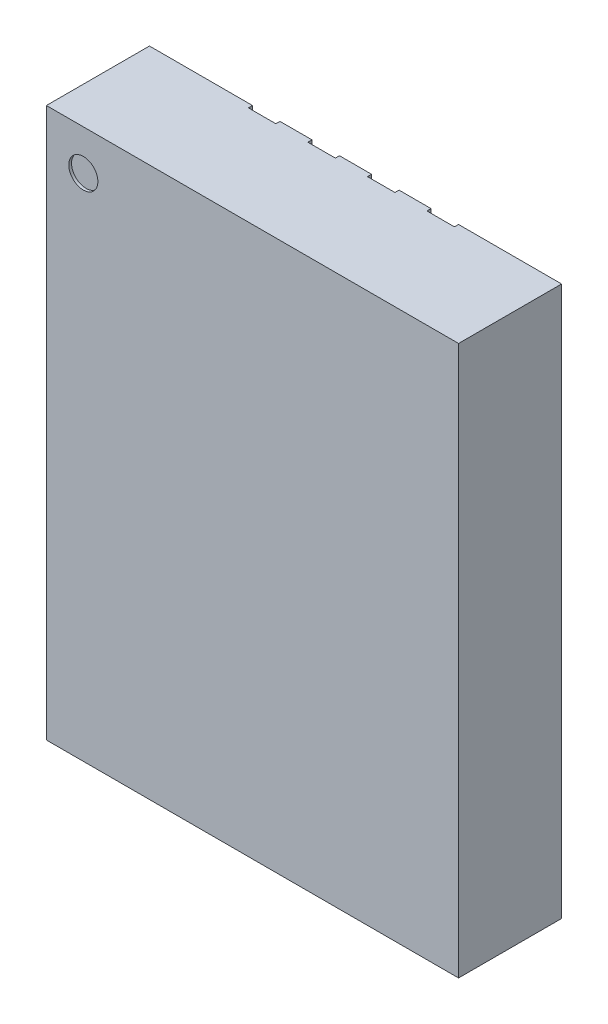
ISO-10303-21;
HEADER;
FILE_DESCRIPTION(('STEP AP214'),'2;1');
FILE_NAME('part.step','',(''),(''),'','','');
FILE_SCHEMA(('AUTOMOTIVE_DESIGN { 1 0 10303 214 1 1 1 1 }'));
ENDSEC;
DATA;
#1=APPLICATION_CONTEXT('core data for automotive mechanical design processes');
#2=APPLICATION_PROTOCOL_DEFINITION('international standard','automotive_design',2000,#1);
#3=PRODUCT_CONTEXT('',#1,'mechanical');
#4=PRODUCT('Part','Part','',(#3));
#5=PRODUCT_RELATED_PRODUCT_CATEGORY('part','',(#4));
#6=PRODUCT_DEFINITION_FORMATION('','',#4);
#7=PRODUCT_DEFINITION_CONTEXT('part definition',#1,'design');
#8=PRODUCT_DEFINITION('design','',#6,#7);
#9=PRODUCT_DEFINITION_SHAPE('','',#8);
#10=(LENGTH_UNIT() NAMED_UNIT(*) SI_UNIT(.MILLI.,.METRE.));
#11=(NAMED_UNIT(*) PLANE_ANGLE_UNIT() SI_UNIT($,.RADIAN.));
#12=(NAMED_UNIT(*) SI_UNIT($,.STERADIAN.) SOLID_ANGLE_UNIT());
#13=UNCERTAINTY_MEASURE_WITH_UNIT(LENGTH_MEASURE(1.E-05),#10,'distance_accuracy_value','');
#14=(GEOMETRIC_REPRESENTATION_CONTEXT(3) GLOBAL_UNCERTAINTY_ASSIGNED_CONTEXT((#13)) GLOBAL_UNIT_ASSIGNED_CONTEXT((#10,
#11,#12)) REPRESENTATION_CONTEXT('',''));
#15=CARTESIAN_POINT('',(0.,0.,0.));
#16=DIRECTION('',(0.,0.,1.));
#17=DIRECTION('',(1.,0.,0.));
#18=AXIS2_PLACEMENT_3D('',#15,#16,#17);
#19=CARTESIAN_POINT('',(-1.231222,1.707331,0.73));
#20=DIRECTION('',(0.,0.,1.));
#21=DIRECTION('',(1.,0.,0.));
#22=AXIS2_PLACEMENT_3D('',#19,#20,#21);
#23=PLANE('',#22);
#24=CARTESIAN_POINT('',(-1.231222,1.707331,0.73));
#25=DIRECTION('',(0.,0.,1.));
#26=DIRECTION('',(1.,0.,0.));
#27=AXIS2_PLACEMENT_3D('',#24,#25,#26);
#28=CIRCLE('',#27,0.105928);
#29=CARTESIAN_POINT('',(-1.33715,1.707331,0.73));
#30=VERTEX_POINT('',#29);
#31=EDGE_CURVE('E27',#30,#30,#28,.T.);
#32=ORIENTED_EDGE('',*,*,#31,.T.);
#33=EDGE_LOOP('',(#32));
#34=FACE_BOUND('',#33,.T.);
#35=ADVANCED_FACE('F17',(#34),#23,.T.);
#36=CARTESIAN_POINT('',(0.55,-1.425,0.));
#37=DIRECTION('',(0.,-1.,0.));
#38=DIRECTION('',(0.,0.,-1.));
#39=AXIS2_PLACEMENT_3D('',#36,#37,#38);
#40=PLANE('',#39);
#41=DIRECTION('',(0.,0.,1.));
#42=VECTOR('',#41,1.);
#43=CARTESIAN_POINT('',(0.55,-1.425,0.));
#44=LINE('',#43,#42);
#45=CARTESIAN_POINT('',(0.55,-1.425,0.));
#46=VERTEX_POINT('',#45);
#47=CARTESIAN_POINT('',(0.55,-1.425,0.03));
#48=VERTEX_POINT('',#47);
#49=EDGE_CURVE('E21',#46,#48,#44,.T.);
#50=ORIENTED_EDGE('',*,*,#49,.F.);
#51=DIRECTION('',(-1.,0.,0.));
#52=VECTOR('',#51,1.);
#53=CARTESIAN_POINT('',(0.55,-1.425,0.));
#54=LINE('',#53,#52);
#55=CARTESIAN_POINT('',(0.316666666667,-1.425,0.));
#56=VERTEX_POINT('',#55);
#57=EDGE_CURVE('E660',#46,#56,#54,.T.);
#58=ORIENTED_EDGE('',*,*,#57,.T.);
#59=DIRECTION('',(0.,0.,1.));
#60=VECTOR('',#59,1.);
#61=CARTESIAN_POINT('',(0.316666666667,-1.425,0.));
#62=LINE('',#61,#60);
#63=CARTESIAN_POINT('',(0.316666666667,-1.425,0.03));
#64=VERTEX_POINT('',#63);
#65=EDGE_CURVE('E488',#56,#64,#62,.T.);
#66=ORIENTED_EDGE('',*,*,#65,.T.);
#67=DIRECTION('',(-1.,0.,0.));
#68=VECTOR('',#67,1.);
#69=CARTESIAN_POINT('',(0.55,-1.425,0.03));
#70=LINE('',#69,#68);
#71=EDGE_CURVE('E372',#48,#64,#70,.T.);
#72=ORIENTED_EDGE('',*,*,#71,.F.);
#73=EDGE_LOOP('',(#50,#58,#66,#72));
#74=FACE_BOUND('',#73,.T.);
#75=ADVANCED_FACE('F19',(#74),#40,.F.);
#76=CARTESIAN_POINT('',(0.116666666667,-1.425,0.));
#77=DIRECTION('',(0.,-1.,0.));
#78=DIRECTION('',(0.,0.,-1.));
#79=AXIS2_PLACEMENT_3D('',#76,#77,#78);
#80=PLANE('',#79);
#81=DIRECTION('',(0.,0.,1.));
#82=VECTOR('',#81,1.);
#83=CARTESIAN_POINT('',(0.116666666667,-1.425,0.));
#84=LINE('',#83,#82);
#85=CARTESIAN_POINT('',(0.116666666667,-1.425,0.));
#86=VERTEX_POINT('',#85);
#87=CARTESIAN_POINT('',(0.116666666667,-1.425,0.03));
#88=VERTEX_POINT('',#87);
#89=EDGE_CURVE('E492',#86,#88,#84,.T.);
#90=ORIENTED_EDGE('',*,*,#89,.F.);
#91=DIRECTION('',(-1.,0.,0.));
#92=VECTOR('',#91,1.);
#93=CARTESIAN_POINT('',(0.116666666667,-1.425,0.));
#94=LINE('',#93,#92);
#95=CARTESIAN_POINT('',(-0.116666666667,-1.425,0.));
#96=VERTEX_POINT('',#95);
#97=EDGE_CURVE('E399',#86,#96,#94,.T.);
#98=ORIENTED_EDGE('',*,*,#97,.T.);
#99=DIRECTION('',(0.,0.,1.));
#100=VECTOR('',#99,1.);
#101=CARTESIAN_POINT('',(-0.116666666667,-1.425,0.));
#102=LINE('',#101,#100);
#103=CARTESIAN_POINT('',(-0.116666666667,-1.425,0.03));
#104=VERTEX_POINT('',#103);
#105=EDGE_CURVE('E468',#96,#104,#102,.T.);
#106=ORIENTED_EDGE('',*,*,#105,.T.);
#107=DIRECTION('',(-1.,0.,0.));
#108=VECTOR('',#107,1.);
#109=CARTESIAN_POINT('',(0.116666666667,-1.425,0.03));
#110=LINE('',#109,#108);
#111=EDGE_CURVE('E582',#88,#104,#110,.T.);
#112=ORIENTED_EDGE('',*,*,#111,.F.);
#113=EDGE_LOOP('',(#90,#98,#106,#112));
#114=FACE_BOUND('',#113,.T.);
#115=ADVANCED_FACE('F697',(#114),#80,.F.);
#116=CARTESIAN_POINT('',(-0.316666666667,-1.425,0.));
#117=DIRECTION('',(0.,-1.,0.));
#118=DIRECTION('',(0.,0.,-1.));
#119=AXIS2_PLACEMENT_3D('',#116,#117,#118);
#120=PLANE('',#119);
#121=DIRECTION('',(0.,0.,1.));
#122=VECTOR('',#121,1.);
#123=CARTESIAN_POINT('',(-0.316666666667,-1.425,0.));
#124=LINE('',#123,#122);
#125=CARTESIAN_POINT('',(-0.316666666667,-1.425,0.));
#126=VERTEX_POINT('',#125);
#127=CARTESIAN_POINT('',(-0.316666666667,-1.425,0.03));
#128=VERTEX_POINT('',#127);
#129=EDGE_CURVE('E442',#126,#128,#124,.T.);
#130=ORIENTED_EDGE('',*,*,#129,.F.);
#131=DIRECTION('',(-1.,0.,0.));
#132=VECTOR('',#131,1.);
#133=CARTESIAN_POINT('',(-0.316666666667,-1.425,0.));
#134=LINE('',#133,#132);
#135=CARTESIAN_POINT('',(-0.55,-1.425,0.));
#136=VERTEX_POINT('',#135);
#137=EDGE_CURVE('E443',#126,#136,#134,.T.);
#138=ORIENTED_EDGE('',*,*,#137,.T.);
#139=DIRECTION('',(0.,0.,1.));
#140=VECTOR('',#139,1.);
#141=CARTESIAN_POINT('',(-0.55,-1.425,0.));
#142=LINE('',#141,#140);
#143=CARTESIAN_POINT('',(-0.55,-1.425,0.03));
#144=VERTEX_POINT('',#143);
#145=EDGE_CURVE('E641',#136,#144,#142,.T.);
#146=ORIENTED_EDGE('',*,*,#145,.T.);
#147=DIRECTION('',(-1.,0.,0.));
#148=VECTOR('',#147,1.);
#149=CARTESIAN_POINT('',(-0.316666666667,-1.425,0.03));
#150=LINE('',#149,#148);
#151=EDGE_CURVE('E479',#128,#144,#150,.T.);
#152=ORIENTED_EDGE('',*,*,#151,.F.);
#153=EDGE_LOOP('',(#130,#138,#146,#152));
#154=FACE_BOUND('',#153,.T.);
#155=ADVANCED_FACE('F714',(#154),#120,.F.);
#156=CARTESIAN_POINT('',(-0.316666666667,1.425,0.));
#157=DIRECTION('',(0.,-1.,0.));
#158=DIRECTION('',(0.,0.,-1.));
#159=AXIS2_PLACEMENT_3D('',#156,#157,#158);
#160=PLANE('',#159);
#161=DIRECTION('',(0.,0.,1.));
#162=VECTOR('',#161,1.);
#163=CARTESIAN_POINT('',(-0.316666666667,1.425,0.));
#164=LINE('',#163,#162);
#165=CARTESIAN_POINT('',(-0.316666666667,1.425,0.));
#166=VERTEX_POINT('',#165);
#167=CARTESIAN_POINT('',(-0.316666666667,1.425,0.03));
#168=VERTEX_POINT('',#167);
#169=EDGE_CURVE('E473',#166,#168,#164,.T.);
#170=ORIENTED_EDGE('',*,*,#169,.T.);
#171=DIRECTION('',(-1.,0.,0.));
#172=VECTOR('',#171,1.);
#173=CARTESIAN_POINT('',(-0.316666666667,1.425,0.03));
#174=LINE('',#173,#172);
#175=CARTESIAN_POINT('',(-0.55,1.425,0.03));
#176=VERTEX_POINT('',#175);
#177=EDGE_CURVE('E367',#168,#176,#174,.T.);
#178=ORIENTED_EDGE('',*,*,#177,.T.);
#179=DIRECTION('',(0.,0.,1.));
#180=VECTOR('',#179,1.);
#181=CARTESIAN_POINT('',(-0.55,1.425,0.));
#182=LINE('',#181,#180);
#183=CARTESIAN_POINT('',(-0.55,1.425,0.));
#184=VERTEX_POINT('',#183);
#185=EDGE_CURVE('E638',#184,#176,#182,.T.);
#186=ORIENTED_EDGE('',*,*,#185,.F.);
#187=DIRECTION('',(-1.,0.,0.));
#188=VECTOR('',#187,1.);
#189=CARTESIAN_POINT('',(-0.316666666667,1.425,0.));
#190=LINE('',#189,#188);
#191=EDGE_CURVE('E421',#166,#184,#190,.T.);
#192=ORIENTED_EDGE('',*,*,#191,.F.);
#193=EDGE_LOOP('',(#170,#178,#186,#192));
#194=FACE_BOUND('',#193,.T.);
#195=ADVANCED_FACE('F732',(#194),#160,.T.);
#196=CARTESIAN_POINT('',(0.116666666667,1.425,0.));
#197=DIRECTION('',(0.,-1.,0.));
#198=DIRECTION('',(0.,0.,-1.));
#199=AXIS2_PLACEMENT_3D('',#196,#197,#198);
#200=PLANE('',#199);
#201=DIRECTION('',(0.,0.,1.));
#202=VECTOR('',#201,1.);
#203=CARTESIAN_POINT('',(0.116666666667,1.425,0.));
#204=LINE('',#203,#202);
#205=CARTESIAN_POINT('',(0.116666666667,1.425,0.));
#206=VERTEX_POINT('',#205);
#207=CARTESIAN_POINT('',(0.116666666667,1.425,0.03));
#208=VERTEX_POINT('',#207);
#209=EDGE_CURVE('E478',#206,#208,#204,.T.);
#210=ORIENTED_EDGE('',*,*,#209,.T.);
#211=DIRECTION('',(-1.,0.,0.));
#212=VECTOR('',#211,1.);
#213=CARTESIAN_POINT('',(0.116666666667,1.425,0.03));
#214=LINE('',#213,#212);
#215=CARTESIAN_POINT('',(-0.116666666667,1.425,0.03));
#216=VERTEX_POINT('',#215);
#217=EDGE_CURVE('E611',#208,#216,#214,.T.);
#218=ORIENTED_EDGE('',*,*,#217,.T.);
#219=DIRECTION('',(0.,0.,1.));
#220=VECTOR('',#219,1.);
#221=CARTESIAN_POINT('',(-0.116666666667,1.425,0.));
#222=LINE('',#221,#220);
#223=CARTESIAN_POINT('',(-0.116666666667,1.425,0.));
#224=VERTEX_POINT('',#223);
#225=EDGE_CURVE('E471',#224,#216,#222,.T.);
#226=ORIENTED_EDGE('',*,*,#225,.F.);
#227=DIRECTION('',(-1.,0.,0.));
#228=VECTOR('',#227,1.);
#229=CARTESIAN_POINT('',(0.116666666667,1.425,0.));
#230=LINE('',#229,#228);
#231=EDGE_CURVE('E604',#206,#224,#230,.T.);
#232=ORIENTED_EDGE('',*,*,#231,.F.);
#233=EDGE_LOOP('',(#210,#218,#226,#232));
#234=FACE_BOUND('',#233,.T.);
#235=ADVANCED_FACE('F744',(#234),#200,.T.);
#236=CARTESIAN_POINT('',(0.55,1.425,0.));
#237=DIRECTION('',(0.,-1.,0.));
#238=DIRECTION('',(0.,0.,-1.));
#239=AXIS2_PLACEMENT_3D('',#236,#237,#238);
#240=PLANE('',#239);
#241=DIRECTION('',(0.,0.,1.));
#242=VECTOR('',#241,1.);
#243=CARTESIAN_POINT('',(0.55,1.425,0.));
#244=LINE('',#243,#242);
#245=CARTESIAN_POINT('',(0.55,1.425,0.));
#246=VERTEX_POINT('',#245);
#247=CARTESIAN_POINT('',(0.55,1.425,0.03));
#248=VERTEX_POINT('',#247);
#249=EDGE_CURVE('E530',#246,#248,#244,.T.);
#250=ORIENTED_EDGE('',*,*,#249,.T.);
#251=DIRECTION('',(-1.,0.,0.));
#252=VECTOR('',#251,1.);
#253=CARTESIAN_POINT('',(0.55,1.425,0.03));
#254=LINE('',#253,#252);
#255=CARTESIAN_POINT('',(0.316666666667,1.425,0.03));
#256=VERTEX_POINT('',#255);
#257=EDGE_CURVE('E342',#248,#256,#254,.T.);
#258=ORIENTED_EDGE('',*,*,#257,.T.);
#259=DIRECTION('',(0.,0.,1.));
#260=VECTOR('',#259,1.);
#261=CARTESIAN_POINT('',(0.316666666667,1.425,0.));
#262=LINE('',#261,#260);
#263=CARTESIAN_POINT('',(0.316666666667,1.425,0.));
#264=VERTEX_POINT('',#263);
#265=EDGE_CURVE('E413',#264,#256,#262,.T.);
#266=ORIENTED_EDGE('',*,*,#265,.F.);
#267=DIRECTION('',(-1.,0.,0.));
#268=VECTOR('',#267,1.);
#269=CARTESIAN_POINT('',(0.55,1.425,0.));
#270=LINE('',#269,#268);
#271=EDGE_CURVE('E414',#246,#264,#270,.T.);
#272=ORIENTED_EDGE('',*,*,#271,.F.);
#273=EDGE_LOOP('',(#250,#258,#266,#272));
#274=FACE_BOUND('',#273,.T.);
#275=ADVANCED_FACE('F760',(#274),#240,.T.);
#276=CARTESIAN_POINT('',(-1.231222,1.707331,0.75));
#277=DIRECTION('',(0.,0.,1.));
#278=DIRECTION('',(1.,0.,0.));
#279=AXIS2_PLACEMENT_3D('',#276,#277,#278);
#280=CYLINDRICAL_SURFACE('',#279,0.105928);
#281=ORIENTED_EDGE('',*,*,#31,.F.);
#282=DIRECTION('',(0.,0.,1.));
#283=VECTOR('',#282,1.);
#284=CARTESIAN_POINT('',(-1.33715,1.707331,0.75));
#285=LINE('',#284,#283);
#286=CARTESIAN_POINT('',(-1.33715,1.707331,0.75));
#287=VERTEX_POINT('',#286);
#288=EDGE_CURVE('E11',#30,#287,#285,.T.);
#289=ORIENTED_EDGE('',*,*,#288,.T.);
#290=CARTESIAN_POINT('',(-1.231222,1.707331,0.75));
#291=DIRECTION('',(0.,0.,1.));
#292=DIRECTION('',(1.,0.,0.));
#293=AXIS2_PLACEMENT_3D('',#290,#291,#292);
#294=CIRCLE('',#293,0.105928);
#295=EDGE_CURVE('E433',#287,#287,#294,.T.);
#296=ORIENTED_EDGE('',*,*,#295,.T.);
#297=ORIENTED_EDGE('',*,*,#288,.F.);
#298=EDGE_LOOP('',(#281,#289,#296,#297));
#299=FACE_BOUND('',#298,.T.);
#300=ADVANCED_FACE('F821',(#299),#280,.F.);
#301=CARTESIAN_POINT('',(0.55,-2.,0.));
#302=DIRECTION('',(-1.,0.,0.));
#303=DIRECTION('',(0.,0.,1.));
#304=AXIS2_PLACEMENT_3D('',#301,#302,#303);
#305=PLANE('',#304);
#306=DIRECTION('',(0.,0.,1.));
#307=VECTOR('',#306,1.);
#308=CARTESIAN_POINT('',(0.55,-2.,0.));
#309=LINE('',#308,#307);
#310=CARTESIAN_POINT('',(0.55,-2.,0.));
#311=VERTEX_POINT('',#310);
#312=CARTESIAN_POINT('',(0.55,-2.,0.03));
#313=VERTEX_POINT('',#312);
#314=EDGE_CURVE('E451',#311,#313,#309,.T.);
#315=ORIENTED_EDGE('',*,*,#314,.F.);
#316=DIRECTION('',(0.,1.,0.));
#317=VECTOR('',#316,1.);
#318=CARTESIAN_POINT('',(0.55,-2.,0.));
#319=LINE('',#318,#317);
#320=EDGE_CURVE('E662',#311,#46,#319,.T.);
#321=ORIENTED_EDGE('',*,*,#320,.T.);
#322=ORIENTED_EDGE('',*,*,#49,.T.);
#323=DIRECTION('',(0.,1.,0.));
#324=VECTOR('',#323,1.);
#325=CARTESIAN_POINT('',(0.55,-2.,0.03));
#326=LINE('',#325,#324);
#327=EDGE_CURVE('E368',#313,#48,#326,.T.);
#328=ORIENTED_EDGE('',*,*,#327,.F.);
#329=EDGE_LOOP('',(#315,#321,#322,#328));
#330=FACE_BOUND('',#329,.T.);
#331=ADVANCED_FACE('F671',(#330),#305,.F.);
#332=CARTESIAN_POINT('',(0.,0.,0.));
#333=DIRECTION('',(0.,0.,1.));
#334=DIRECTION('',(1.,0.,0.));
#335=AXIS2_PLACEMENT_3D('',#332,#333,#334);
#336=PLANE('',#335);
#337=DIRECTION('',(0.,-1.,0.));
#338=VECTOR('',#337,1.);
#339=CARTESIAN_POINT('',(0.316666666667,-1.425,0.));
#340=LINE('',#339,#338);
#341=CARTESIAN_POINT('',(0.316666666667,-2.,0.));
#342=VERTEX_POINT('',#341);
#343=EDGE_CURVE('E491',#56,#342,#340,.T.);
#344=ORIENTED_EDGE('',*,*,#343,.F.);
#345=ORIENTED_EDGE('',*,*,#57,.F.);
#346=ORIENTED_EDGE('',*,*,#320,.F.);
#347=DIRECTION('',(1.,0.,0.));
#348=VECTOR('',#347,1.);
#349=CARTESIAN_POINT('',(-1.5,-2.,0.));
#350=LINE('',#349,#348);
#351=EDGE_CURVE('E456',#342,#311,#350,.T.);
#352=ORIENTED_EDGE('',*,*,#351,.F.);
#353=EDGE_LOOP('',(#344,#345,#346,#352));
#354=FACE_BOUND('',#353,.T.);
#355=ADVANCED_FACE('F685',(#354),#336,.F.);
#356=CARTESIAN_POINT('',(0.316666666667,-1.425,0.));
#357=DIRECTION('',(1.,0.,0.));
#358=DIRECTION('',(0.,1.,0.));
#359=AXIS2_PLACEMENT_3D('',#356,#357,#358);
#360=PLANE('',#359);
#361=ORIENTED_EDGE('',*,*,#65,.F.);
#362=ORIENTED_EDGE('',*,*,#343,.T.);
#363=DIRECTION('',(0.,0.,1.));
#364=VECTOR('',#363,1.);
#365=CARTESIAN_POINT('',(0.316666666667,-2.,0.));
#366=LINE('',#365,#364);
#367=CARTESIAN_POINT('',(0.316666666667,-2.,0.03));
#368=VERTEX_POINT('',#367);
#369=EDGE_CURVE('E534',#342,#368,#366,.T.);
#370=ORIENTED_EDGE('',*,*,#369,.T.);
#371=DIRECTION('',(0.,-1.,0.));
#372=VECTOR('',#371,1.);
#373=CARTESIAN_POINT('',(0.316666666667,-1.425,0.03));
#374=LINE('',#373,#372);
#375=EDGE_CURVE('E572',#64,#368,#374,.T.);
#376=ORIENTED_EDGE('',*,*,#375,.F.);
#377=EDGE_LOOP('',(#361,#362,#370,#376));
#378=FACE_BOUND('',#377,.T.);
#379=ADVANCED_FACE('F687',(#378),#360,.F.);
#380=CARTESIAN_POINT('',(0.116666666667,-2.,0.));
#381=DIRECTION('',(-1.,0.,0.));
#382=DIRECTION('',(0.,0.,1.));
#383=AXIS2_PLACEMENT_3D('',#380,#381,#382);
#384=PLANE('',#383);
#385=DIRECTION('',(0.,0.,1.));
#386=VECTOR('',#385,1.);
#387=CARTESIAN_POINT('',(0.116666666667,-2.,0.));
#388=LINE('',#387,#386);
#389=CARTESIAN_POINT('',(0.116666666667,-2.,0.));
#390=VERTEX_POINT('',#389);
#391=CARTESIAN_POINT('',(0.116666666667,-2.,0.03));
#392=VERTEX_POINT('',#391);
#393=EDGE_CURVE('E503',#390,#392,#388,.T.);
#394=ORIENTED_EDGE('',*,*,#393,.F.);
#395=DIRECTION('',(0.,1.,0.));
#396=VECTOR('',#395,1.);
#397=CARTESIAN_POINT('',(0.116666666667,-2.,0.));
#398=LINE('',#397,#396);
#399=EDGE_CURVE('E402',#390,#86,#398,.T.);
#400=ORIENTED_EDGE('',*,*,#399,.T.);
#401=ORIENTED_EDGE('',*,*,#89,.T.);
#402=DIRECTION('',(0.,1.,0.));
#403=VECTOR('',#402,1.);
#404=CARTESIAN_POINT('',(0.116666666667,-2.,0.03));
#405=LINE('',#404,#403);
#406=EDGE_CURVE('E575',#392,#88,#405,.T.);
#407=ORIENTED_EDGE('',*,*,#406,.F.);
#408=EDGE_LOOP('',(#394,#400,#401,#407));
#409=FACE_BOUND('',#408,.T.);
#410=ADVANCED_FACE('F693',(#409),#384,.F.);
#411=CARTESIAN_POINT('',(0.,0.,0.));
#412=DIRECTION('',(0.,0.,1.));
#413=DIRECTION('',(1.,0.,0.));
#414=AXIS2_PLACEMENT_3D('',#411,#412,#413);
#415=PLANE('',#414);
#416=DIRECTION('',(0.,-1.,0.));
#417=VECTOR('',#416,1.);
#418=CARTESIAN_POINT('',(-0.116666666667,-1.425,0.));
#419=LINE('',#418,#417);
#420=CARTESIAN_POINT('',(-0.116666666667,-2.,0.));
#421=VERTEX_POINT('',#420);
#422=EDGE_CURVE('E403',#96,#421,#419,.T.);
#423=ORIENTED_EDGE('',*,*,#422,.F.);
#424=ORIENTED_EDGE('',*,*,#97,.F.);
#425=ORIENTED_EDGE('',*,*,#399,.F.);
#426=DIRECTION('',(1.,0.,0.));
#427=VECTOR('',#426,1.);
#428=CARTESIAN_POINT('',(-1.5,-2.,0.));
#429=LINE('',#428,#427);
#430=EDGE_CURVE('E389',#421,#390,#429,.T.);
#431=ORIENTED_EDGE('',*,*,#430,.F.);
#432=EDGE_LOOP('',(#423,#424,#425,#431));
#433=FACE_BOUND('',#432,.T.);
#434=ADVANCED_FACE('F813',(#433),#415,.F.);
#435=CARTESIAN_POINT('',(-0.116666666667,-1.425,0.));
#436=DIRECTION('',(1.,0.,0.));
#437=DIRECTION('',(0.,1.,0.));
#438=AXIS2_PLACEMENT_3D('',#435,#436,#437);
#439=PLANE('',#438);
#440=ORIENTED_EDGE('',*,*,#105,.F.);
#441=ORIENTED_EDGE('',*,*,#422,.T.);
#442=DIRECTION('',(0.,0.,1.));
#443=VECTOR('',#442,1.);
#444=CARTESIAN_POINT('',(-0.116666666667,-2.,0.));
#445=LINE('',#444,#443);
#446=CARTESIAN_POINT('',(-0.116666666667,-2.,0.03));
#447=VERTEX_POINT('',#446);
#448=EDGE_CURVE('E385',#421,#447,#445,.T.);
#449=ORIENTED_EDGE('',*,*,#448,.T.);
#450=DIRECTION('',(0.,-1.,0.));
#451=VECTOR('',#450,1.);
#452=CARTESIAN_POINT('',(-0.116666666667,-1.425,0.03));
#453=LINE('',#452,#451);
#454=EDGE_CURVE('E586',#104,#447,#453,.T.);
#455=ORIENTED_EDGE('',*,*,#454,.F.);
#456=EDGE_LOOP('',(#440,#441,#449,#455));
#457=FACE_BOUND('',#456,.T.);
#458=ADVANCED_FACE('F702',(#457),#439,.F.);
#459=CARTESIAN_POINT('',(-0.316666666667,-1.999999996663,0.));
#460=DIRECTION('',(-1.,0.,0.));
#461=DIRECTION('',(0.,0.,1.));
#462=AXIS2_PLACEMENT_3D('',#459,#460,#461);
#463=PLANE('',#462);
#464=DIRECTION('',(0.,0.,1.));
#465=VECTOR('',#464,1.);
#466=CARTESIAN_POINT('',(-0.316666666667,-1.999999996663,0.));
#467=LINE('',#466,#465);
#468=CARTESIAN_POINT('',(-0.316666666667,-1.9999999983933,0.));
#469=VERTEX_POINT('',#468);
#470=CARTESIAN_POINT('',(-0.316666666667,-1.99999999728096,0.03));
#471=VERTEX_POINT('',#470);
#472=EDGE_CURVE('E354',#469,#471,#467,.T.);
#473=ORIENTED_EDGE('',*,*,#472,.F.);
#474=DIRECTION('',(0.,1.,0.));
#475=VECTOR('',#474,1.);
#476=CARTESIAN_POINT('',(-0.316666666667,-1.999999996663,0.));
#477=LINE('',#476,#475);
#478=EDGE_CURVE('E438',#469,#126,#477,.T.);
#479=ORIENTED_EDGE('',*,*,#478,.T.);
#480=ORIENTED_EDGE('',*,*,#129,.T.);
#481=DIRECTION('',(0.,1.,0.));
#482=VECTOR('',#481,1.);
#483=CARTESIAN_POINT('',(-0.316666666667,-1.999999996663,0.03));
#484=LINE('',#483,#482);
#485=EDGE_CURVE('E484',#471,#128,#484,.T.);
#486=ORIENTED_EDGE('',*,*,#485,.F.);
#487=EDGE_LOOP('',(#473,#479,#480,#486));
#488=FACE_BOUND('',#487,.T.);
#489=ADVANCED_FACE('F708',(#488),#463,.F.);
#490=CARTESIAN_POINT('',(0.,0.,0.));
#491=DIRECTION('',(0.,0.,1.));
#492=DIRECTION('',(1.,0.,0.));
#493=AXIS2_PLACEMENT_3D('',#490,#491,#492);
#494=PLANE('',#493);
#495=DIRECTION('',(0.,-1.,0.));
#496=VECTOR('',#495,1.);
#497=CARTESIAN_POINT('',(-0.55,-1.425,0.));
#498=LINE('',#497,#496);
#499=CARTESIAN_POINT('',(-0.55,-2.,0.));
#500=VERTEX_POINT('',#499);
#501=EDGE_CURVE('E644',#136,#500,#498,.T.);
#502=ORIENTED_EDGE('',*,*,#501,.F.);
#503=ORIENTED_EDGE('',*,*,#137,.F.);
#504=ORIENTED_EDGE('',*,*,#478,.F.);
#505=DIRECTION('',(1.,0.,0.));
#506=VECTOR('',#505,1.);
#507=CARTESIAN_POINT('',(-1.5,-2.,0.));
#508=LINE('',#507,#506);
#509=EDGE_CURVE('E359',#500,#469,#508,.T.);
#510=ORIENTED_EDGE('',*,*,#509,.F.);
#511=EDGE_LOOP('',(#502,#503,#504,#510));
#512=FACE_BOUND('',#511,.T.);
#513=ADVANCED_FACE('F805',(#512),#494,.F.);
#514=CARTESIAN_POINT('',(-0.55,-1.425,0.));
#515=DIRECTION('',(1.,0.,0.));
#516=DIRECTION('',(0.,1.,0.));
#517=AXIS2_PLACEMENT_3D('',#514,#515,#516);
#518=PLANE('',#517);
#519=ORIENTED_EDGE('',*,*,#145,.F.);
#520=ORIENTED_EDGE('',*,*,#501,.T.);
#521=DIRECTION('',(0.,0.,1.));
#522=VECTOR('',#521,1.);
#523=CARTESIAN_POINT('',(-0.55,-2.,0.));
#524=LINE('',#523,#522);
#525=CARTESIAN_POINT('',(-0.55,-2.,0.03));
#526=VERTEX_POINT('',#525);
#527=EDGE_CURVE('E511',#500,#526,#524,.T.);
#528=ORIENTED_EDGE('',*,*,#527,.T.);
#529=DIRECTION('',(0.,-1.,0.));
#530=VECTOR('',#529,1.);
#531=CARTESIAN_POINT('',(-0.55,-1.425,0.03));
#532=LINE('',#531,#530);
#533=EDGE_CURVE('E483',#144,#526,#532,.T.);
#534=ORIENTED_EDGE('',*,*,#533,.F.);
#535=EDGE_LOOP('',(#519,#520,#528,#534));
#536=FACE_BOUND('',#535,.T.);
#537=ADVANCED_FACE('F718',(#536),#518,.F.);
#538=CARTESIAN_POINT('',(1.5,-2.,0.));
#539=DIRECTION('',(-1.,0.,0.));
#540=DIRECTION('',(0.,0.,1.));
#541=AXIS2_PLACEMENT_3D('',#538,#539,#540);
#542=PLANE('',#541);
#543=DIRECTION('',(0.,0.,1.));
#544=VECTOR('',#543,1.);
#545=CARTESIAN_POINT('',(1.5,-2.,0.));
#546=LINE('',#545,#544);
#547=CARTESIAN_POINT('',(1.5,-2.,0.));
#548=VERTEX_POINT('',#547);
#549=CARTESIAN_POINT('',(1.5,-2.,0.75));
#550=VERTEX_POINT('',#549);
#551=EDGE_CURVE('E345',#548,#550,#546,.T.);
#552=ORIENTED_EDGE('',*,*,#551,.F.);
#553=DIRECTION('',(0.,1.,0.));
#554=VECTOR('',#553,1.);
#555=CARTESIAN_POINT('',(1.5,-2.,0.));
#556=LINE('',#555,#554);
#557=CARTESIAN_POINT('',(1.5,2.,0.));
#558=VERTEX_POINT('',#557);
#559=EDGE_CURVE('E561',#548,#558,#556,.T.);
#560=ORIENTED_EDGE('',*,*,#559,.T.);
#561=DIRECTION('',(0.,0.,1.));
#562=VECTOR('',#561,1.);
#563=CARTESIAN_POINT('',(1.5,2.,0.));
#564=LINE('',#563,#562);
#565=CARTESIAN_POINT('',(1.5,2.,0.75));
#566=VERTEX_POINT('',#565);
#567=EDGE_CURVE('E487',#558,#566,#564,.T.);
#568=ORIENTED_EDGE('',*,*,#567,.T.);
#569=DIRECTION('',(0.,1.,0.));
#570=VECTOR('',#569,1.);
#571=CARTESIAN_POINT('',(1.5,-2.,0.75));
#572=LINE('',#571,#570);
#573=EDGE_CURVE('E430',#550,#566,#572,.T.);
#574=ORIENTED_EDGE('',*,*,#573,.F.);
#575=EDGE_LOOP('',(#552,#560,#568,#574));
#576=FACE_BOUND('',#575,.T.);
#577=ADVANCED_FACE('F777',(#576),#542,.F.);
#578=CARTESIAN_POINT('',(-0.75,2.,0.));
#579=DIRECTION('',(1.,0.,0.));
#580=DIRECTION('',(0.,1.,0.));
#581=AXIS2_PLACEMENT_3D('',#578,#579,#580);
#582=PLANE('',#581);
#583=DIRECTION('',(0.,0.,1.));
#584=VECTOR('',#583,1.);
#585=CARTESIAN_POINT('',(-0.75,2.,0.));
#586=LINE('',#585,#584);
#587=CARTESIAN_POINT('',(-0.75,2.,0.));
#588=VERTEX_POINT('',#587);
#589=CARTESIAN_POINT('',(-0.75,2.,0.03));
#590=VERTEX_POINT('',#589);
#591=EDGE_CURVE('E315',#588,#590,#586,.T.);
#592=ORIENTED_EDGE('',*,*,#591,.T.);
#593=DIRECTION('',(0.,-1.,0.));
#594=VECTOR('',#593,1.);
#595=CARTESIAN_POINT('',(-0.75,2.,0.03));
#596=LINE('',#595,#594);
#597=CARTESIAN_POINT('',(-0.75,-2.,0.03));
#598=VERTEX_POINT('',#597);
#599=EDGE_CURVE('E578',#590,#598,#596,.T.);
#600=ORIENTED_EDGE('',*,*,#599,.T.);
#601=DIRECTION('',(0.,0.,1.));
#602=VECTOR('',#601,1.);
#603=CARTESIAN_POINT('',(-0.75,-2.,0.));
#604=LINE('',#603,#602);
#605=CARTESIAN_POINT('',(-0.75,-2.,0.));
#606=VERTEX_POINT('',#605);
#607=EDGE_CURVE('E498',#606,#598,#604,.T.);
#608=ORIENTED_EDGE('',*,*,#607,.F.);
#609=DIRECTION('',(0.,-1.,0.));
#610=VECTOR('',#609,1.);
#611=CARTESIAN_POINT('',(-0.75,2.,0.));
#612=LINE('',#611,#610);
#613=EDGE_CURVE('E434',#588,#606,#612,.T.);
#614=ORIENTED_EDGE('',*,*,#613,.F.);
#615=EDGE_LOOP('',(#592,#600,#608,#614));
#616=FACE_BOUND('',#615,.T.);
#617=ADVANCED_FACE('F723',(#616),#582,.T.);
#618=CARTESIAN_POINT('',(-0.55,1.425,0.));
#619=DIRECTION('',(-1.,0.,0.));
#620=DIRECTION('',(0.,0.,1.));
#621=AXIS2_PLACEMENT_3D('',#618,#619,#620);
#622=PLANE('',#621);
#623=ORIENTED_EDGE('',*,*,#185,.T.);
#624=DIRECTION('',(0.,1.,0.));
#625=VECTOR('',#624,1.);
#626=CARTESIAN_POINT('',(-0.55,1.425,0.03));
#627=LINE('',#626,#625);
#628=CARTESIAN_POINT('',(-0.55,2.,0.03));
#629=VERTEX_POINT('',#628);
#630=EDGE_CURVE('E594',#176,#629,#627,.T.);
#631=ORIENTED_EDGE('',*,*,#630,.T.);
#632=DIRECTION('',(0.,0.,1.));
#633=VECTOR('',#632,1.);
#634=CARTESIAN_POINT('',(-0.55,2.,0.));
#635=LINE('',#634,#633);
#636=CARTESIAN_POINT('',(-0.55,2.,0.));
#637=VERTEX_POINT('',#636);
#638=EDGE_CURVE('E447',#637,#629,#635,.T.);
#639=ORIENTED_EDGE('',*,*,#638,.F.);
#640=DIRECTION('',(0.,1.,0.));
#641=VECTOR('',#640,1.);
#642=CARTESIAN_POINT('',(-0.55,1.425,0.));
#643=LINE('',#642,#641);
#644=EDGE_CURVE('E425',#184,#637,#643,.T.);
#645=ORIENTED_EDGE('',*,*,#644,.F.);
#646=EDGE_LOOP('',(#623,#631,#639,#645));
#647=FACE_BOUND('',#646,.T.);
#648=ADVANCED_FACE('F729',(#647),#622,.T.);
#649=CARTESIAN_POINT('',(0.,0.,0.));
#650=DIRECTION('',(0.,0.,1.));
#651=DIRECTION('',(1.,0.,0.));
#652=AXIS2_PLACEMENT_3D('',#649,#650,#651);
#653=PLANE('',#652);
#654=DIRECTION('',(-1.,0.,0.));
#655=VECTOR('',#654,1.);
#656=CARTESIAN_POINT('',(1.5,2.,0.));
#657=LINE('',#656,#655);
#658=CARTESIAN_POINT('',(-0.316666666667,2.,0.));
#659=VERTEX_POINT('',#658);
#660=EDGE_CURVE('E378',#659,#637,#657,.T.);
#661=ORIENTED_EDGE('',*,*,#660,.F.);
#662=DIRECTION('',(0.,-1.,0.));
#663=VECTOR('',#662,1.);
#664=CARTESIAN_POINT('',(-0.316666666667,2.,0.));
#665=LINE('',#664,#663);
#666=EDGE_CURVE('E426',#659,#166,#665,.T.);
#667=ORIENTED_EDGE('',*,*,#666,.T.);
#668=ORIENTED_EDGE('',*,*,#191,.T.);
#669=ORIENTED_EDGE('',*,*,#644,.T.);
#670=EDGE_LOOP('',(#661,#667,#668,#669));
#671=FACE_BOUND('',#670,.T.);
#672=ADVANCED_FACE('F931',(#671),#653,.F.);
#673=CARTESIAN_POINT('',(-0.316666666667,2.,0.));
#674=DIRECTION('',(1.,0.,0.));
#675=DIRECTION('',(0.,1.,0.));
#676=AXIS2_PLACEMENT_3D('',#673,#674,#675);
#677=PLANE('',#676);
#678=DIRECTION('',(0.,0.,1.));
#679=VECTOR('',#678,1.);
#680=CARTESIAN_POINT('',(-0.316666666667,2.,0.));
#681=LINE('',#680,#679);
#682=CARTESIAN_POINT('',(-0.316666666667,2.,0.03));
#683=VERTEX_POINT('',#682);
#684=EDGE_CURVE('E374',#659,#683,#681,.T.);
#685=ORIENTED_EDGE('',*,*,#684,.T.);
#686=DIRECTION('',(0.,-1.,0.));
#687=VECTOR('',#686,1.);
#688=CARTESIAN_POINT('',(-0.316666666667,2.,0.03));
#689=LINE('',#688,#687);
#690=EDGE_CURVE('E362',#683,#168,#689,.T.);
#691=ORIENTED_EDGE('',*,*,#690,.T.);
#692=ORIENTED_EDGE('',*,*,#169,.F.);
#693=ORIENTED_EDGE('',*,*,#666,.F.);
#694=EDGE_LOOP('',(#685,#691,#692,#693));
#695=FACE_BOUND('',#694,.T.);
#696=ADVANCED_FACE('F735',(#695),#677,.T.);
#697=CARTESIAN_POINT('',(-0.116666666667,1.425,0.));
#698=DIRECTION('',(-1.,0.,0.));
#699=DIRECTION('',(0.,0.,1.));
#700=AXIS2_PLACEMENT_3D('',#697,#698,#699);
#701=PLANE('',#700);
#702=ORIENTED_EDGE('',*,*,#225,.T.);
#703=DIRECTION('',(0.,1.,0.));
#704=VECTOR('',#703,1.);
#705=CARTESIAN_POINT('',(-0.116666666667,1.425,0.03));
#706=LINE('',#705,#704);
#707=CARTESIAN_POINT('',(-0.116666666667,2.,0.03));
#708=VERTEX_POINT('',#707);
#709=EDGE_CURVE('E366',#216,#708,#706,.T.);
#710=ORIENTED_EDGE('',*,*,#709,.T.);
#711=DIRECTION('',(0.,0.,1.));
#712=VECTOR('',#711,1.);
#713=CARTESIAN_POINT('',(-0.116666666667,2.,0.));
#714=LINE('',#713,#712);
#715=CARTESIAN_POINT('',(-0.116666666667,2.,0.));
#716=VERTEX_POINT('',#715);
#717=EDGE_CURVE('E419',#716,#708,#714,.T.);
#718=ORIENTED_EDGE('',*,*,#717,.F.);
#719=DIRECTION('',(0.,1.,0.));
#720=VECTOR('',#719,1.);
#721=CARTESIAN_POINT('',(-0.116666666667,1.425,0.));
#722=LINE('',#721,#720);
#723=EDGE_CURVE('E474',#224,#716,#722,.T.);
#724=ORIENTED_EDGE('',*,*,#723,.F.);
#725=EDGE_LOOP('',(#702,#710,#718,#724));
#726=FACE_BOUND('',#725,.T.);
#727=ADVANCED_FACE('F741',(#726),#701,.T.);
#728=CARTESIAN_POINT('',(0.,0.,0.));
#729=DIRECTION('',(0.,0.,1.));
#730=DIRECTION('',(1.,0.,0.));
#731=AXIS2_PLACEMENT_3D('',#728,#729,#730);
#732=PLANE('',#731);
#733=DIRECTION('',(-1.,0.,0.));
#734=VECTOR('',#733,1.);
#735=CARTESIAN_POINT('',(1.5,2.,0.));
#736=LINE('',#735,#734);
#737=CARTESIAN_POINT('',(0.116666666667,2.,0.));
#738=VERTEX_POINT('',#737);
#739=EDGE_CURVE('E415',#738,#716,#736,.T.);
#740=ORIENTED_EDGE('',*,*,#739,.F.);
#741=DIRECTION('',(0.,-1.,0.));
#742=VECTOR('',#741,1.);
#743=CARTESIAN_POINT('',(0.116666666667,2.,0.));
#744=LINE('',#743,#742);
#745=EDGE_CURVE('E605',#738,#206,#744,.T.);
#746=ORIENTED_EDGE('',*,*,#745,.T.);
#747=ORIENTED_EDGE('',*,*,#231,.T.);
#748=ORIENTED_EDGE('',*,*,#723,.T.);
#749=EDGE_LOOP('',(#740,#746,#747,#748));
#750=FACE_BOUND('',#749,.T.);
#751=ADVANCED_FACE('F953',(#750),#732,.F.);
#752=CARTESIAN_POINT('',(0.116666666667,2.,0.));
#753=DIRECTION('',(1.,0.,0.));
#754=DIRECTION('',(0.,1.,0.));
#755=AXIS2_PLACEMENT_3D('',#752,#753,#754);
#756=PLANE('',#755);
#757=DIRECTION('',(0.,0.,1.));
#758=VECTOR('',#757,1.);
#759=CARTESIAN_POINT('',(0.116666666667,2.,0.));
#760=LINE('',#759,#758);
#761=CARTESIAN_POINT('',(0.116666666667,2.,0.03));
#762=VERTEX_POINT('',#761);
#763=EDGE_CURVE('E420',#738,#762,#760,.T.);
#764=ORIENTED_EDGE('',*,*,#763,.T.);
#765=DIRECTION('',(0.,-1.,0.));
#766=VECTOR('',#765,1.);
#767=CARTESIAN_POINT('',(0.116666666667,2.,0.03));
#768=LINE('',#767,#766);
#769=EDGE_CURVE('E615',#762,#208,#768,.T.);
#770=ORIENTED_EDGE('',*,*,#769,.T.);
#771=ORIENTED_EDGE('',*,*,#209,.F.);
#772=ORIENTED_EDGE('',*,*,#745,.F.);
#773=EDGE_LOOP('',(#764,#770,#771,#772));
#774=FACE_BOUND('',#773,.T.);
#775=ADVANCED_FACE('F747',(#774),#756,.T.);
#776=CARTESIAN_POINT('',(0.316666666667,1.425,0.));
#777=DIRECTION('',(-1.,0.,0.));
#778=DIRECTION('',(0.,0.,1.));
#779=AXIS2_PLACEMENT_3D('',#776,#777,#778);
#780=PLANE('',#779);
#781=ORIENTED_EDGE('',*,*,#265,.T.);
#782=DIRECTION('',(0.,1.,0.));
#783=VECTOR('',#782,1.);
#784=CARTESIAN_POINT('',(0.316666666667,1.425,0.03));
#785=LINE('',#784,#783);
#786=CARTESIAN_POINT('',(0.316666666667,2.,0.03));
#787=VERTEX_POINT('',#786);
#788=EDGE_CURVE('E619',#256,#787,#785,.T.);
#789=ORIENTED_EDGE('',*,*,#788,.T.);
#790=DIRECTION('',(0.,0.,1.));
#791=VECTOR('',#790,1.);
#792=CARTESIAN_POINT('',(0.316666666667,2.,0.));
#793=LINE('',#792,#791);
#794=CARTESIAN_POINT('',(0.316666666667,2.,0.));
#795=VERTEX_POINT('',#794);
#796=EDGE_CURVE('E390',#795,#787,#793,.T.);
#797=ORIENTED_EDGE('',*,*,#796,.F.);
#798=DIRECTION('',(0.,1.,0.));
#799=VECTOR('',#798,1.);
#800=CARTESIAN_POINT('',(0.316666666667,1.425,0.));
#801=LINE('',#800,#799);
#802=EDGE_CURVE('E410',#264,#795,#801,.T.);
#803=ORIENTED_EDGE('',*,*,#802,.F.);
#804=EDGE_LOOP('',(#781,#789,#797,#803));
#805=FACE_BOUND('',#804,.T.);
#806=ADVANCED_FACE('F757',(#805),#780,.T.);
#807=CARTESIAN_POINT('',(0.,0.,0.));
#808=DIRECTION('',(0.,0.,1.));
#809=DIRECTION('',(1.,0.,0.));
#810=AXIS2_PLACEMENT_3D('',#807,#808,#809);
#811=PLANE('',#810);
#812=DIRECTION('',(-1.,0.,0.));
#813=VECTOR('',#812,1.);
#814=CARTESIAN_POINT('',(1.5,2.,0.));
#815=LINE('',#814,#813);
#816=CARTESIAN_POINT('',(0.55,2.,0.));
#817=VERTEX_POINT('',#816);
#818=EDGE_CURVE('E395',#817,#795,#815,.T.);
#819=ORIENTED_EDGE('',*,*,#818,.F.);
#820=DIRECTION('',(0.,-1.,0.));
#821=VECTOR('',#820,1.);
#822=CARTESIAN_POINT('',(0.55,2.,0.));
#823=LINE('',#822,#821);
#824=EDGE_CURVE('E624',#817,#246,#823,.T.);
#825=ORIENTED_EDGE('',*,*,#824,.T.);
#826=ORIENTED_EDGE('',*,*,#271,.T.);
#827=ORIENTED_EDGE('',*,*,#802,.T.);
#828=EDGE_LOOP('',(#819,#825,#826,#827));
#829=FACE_BOUND('',#828,.T.);
#830=ADVANCED_FACE('F976',(#829),#811,.F.);
#831=CARTESIAN_POINT('',(0.55,2.,0.));
#832=DIRECTION('',(1.,0.,0.));
#833=DIRECTION('',(0.,1.,0.));
#834=AXIS2_PLACEMENT_3D('',#831,#832,#833);
#835=PLANE('',#834);
#836=DIRECTION('',(0.,0.,1.));
#837=VECTOR('',#836,1.);
#838=CARTESIAN_POINT('',(0.55,2.,0.));
#839=LINE('',#838,#837);
#840=CARTESIAN_POINT('',(0.55,2.,0.03));
#841=VERTEX_POINT('',#840);
#842=EDGE_CURVE('E352',#817,#841,#839,.T.);
#843=ORIENTED_EDGE('',*,*,#842,.T.);
#844=DIRECTION('',(0.,-1.,0.));
#845=VECTOR('',#844,1.);
#846=CARTESIAN_POINT('',(0.55,2.,0.03));
#847=LINE('',#846,#845);
#848=EDGE_CURVE('E526',#841,#248,#847,.T.);
#849=ORIENTED_EDGE('',*,*,#848,.T.);
#850=ORIENTED_EDGE('',*,*,#249,.F.);
#851=ORIENTED_EDGE('',*,*,#824,.F.);
#852=EDGE_LOOP('',(#843,#849,#850,#851));
#853=FACE_BOUND('',#852,.T.);
#854=ADVANCED_FACE('F766',(#853),#835,.T.);
#855=CARTESIAN_POINT('',(5.904143E-11,3.9153796E-10,0.03));
#856=DIRECTION('',(0.,0.,1.));
#857=DIRECTION('',(1.,0.,0.));
#858=AXIS2_PLACEMENT_3D('',#855,#856,#857);
#859=PLANE('',#858);
#860=DIRECTION('',(1.,0.,0.));
#861=VECTOR('',#860,1.);
#862=CARTESIAN_POINT('',(0.55,-2.,0.03));
#863=LINE('',#862,#861);
#864=CARTESIAN_POINT('',(0.75,-2.,0.03));
#865=VERTEX_POINT('',#864);
#866=EDGE_CURVE('E455',#313,#865,#863,.T.);
#867=ORIENTED_EDGE('',*,*,#866,.F.);
#868=ORIENTED_EDGE('',*,*,#327,.T.);
#869=ORIENTED_EDGE('',*,*,#71,.T.);
#870=ORIENTED_EDGE('',*,*,#375,.T.);
#871=DIRECTION('',(1.,0.,0.));
#872=VECTOR('',#871,1.);
#873=CARTESIAN_POINT('',(0.116666666667,-2.,0.03));
#874=LINE('',#873,#872);
#875=EDGE_CURVE('E507',#392,#368,#874,.T.);
#876=ORIENTED_EDGE('',*,*,#875,.F.);
#877=ORIENTED_EDGE('',*,*,#406,.T.);
#878=ORIENTED_EDGE('',*,*,#111,.T.);
#879=ORIENTED_EDGE('',*,*,#454,.T.);
#880=DIRECTION('',(1.,-1.668697514E-08,0.));
#881=VECTOR('',#880,1.);
#882=CARTESIAN_POINT('',(-0.316666666667,-1.999999996663,0.03));
#883=LINE('',#882,#881);
#884=EDGE_CURVE('E358',#471,#447,#883,.T.);
#885=ORIENTED_EDGE('',*,*,#884,.F.);
#886=ORIENTED_EDGE('',*,*,#485,.T.);
#887=ORIENTED_EDGE('',*,*,#151,.T.);
#888=ORIENTED_EDGE('',*,*,#533,.T.);
#889=DIRECTION('',(1.,0.,0.));
#890=VECTOR('',#889,1.);
#891=CARTESIAN_POINT('',(-0.75,-2.,0.03));
#892=LINE('',#891,#890);
#893=EDGE_CURVE('E502',#598,#526,#892,.T.);
#894=ORIENTED_EDGE('',*,*,#893,.F.);
#895=ORIENTED_EDGE('',*,*,#599,.F.);
#896=DIRECTION('',(-1.,0.,0.));
#897=VECTOR('',#896,1.);
#898=CARTESIAN_POINT('',(-0.55,2.,0.03));
#899=LINE('',#898,#897);
#900=EDGE_CURVE('E463',#629,#590,#899,.T.);
#901=ORIENTED_EDGE('',*,*,#900,.F.);
#902=ORIENTED_EDGE('',*,*,#630,.F.);
#903=ORIENTED_EDGE('',*,*,#177,.F.);
#904=ORIENTED_EDGE('',*,*,#690,.F.);
#905=DIRECTION('',(1.,0.,0.));
#906=VECTOR('',#905,1.);
#907=CARTESIAN_POINT('',(-0.316666666667,2.,0.03));
#908=LINE('',#907,#906);
#909=EDGE_CURVE('E379',#683,#708,#908,.T.);
#910=ORIENTED_EDGE('',*,*,#909,.T.);
#911=ORIENTED_EDGE('',*,*,#709,.F.);
#912=ORIENTED_EDGE('',*,*,#217,.F.);
#913=ORIENTED_EDGE('',*,*,#769,.F.);
#914=DIRECTION('',(1.,0.,0.));
#915=VECTOR('',#914,1.);
#916=CARTESIAN_POINT('',(0.116666666667,2.,0.03));
#917=LINE('',#916,#915);
#918=EDGE_CURVE('E394',#762,#787,#917,.T.);
#919=ORIENTED_EDGE('',*,*,#918,.T.);
#920=ORIENTED_EDGE('',*,*,#788,.F.);
#921=ORIENTED_EDGE('',*,*,#257,.F.);
#922=ORIENTED_EDGE('',*,*,#848,.F.);
#923=DIRECTION('',(-1.,0.,0.));
#924=VECTOR('',#923,1.);
#925=CARTESIAN_POINT('',(0.75,2.,0.03));
#926=LINE('',#925,#924);
#927=CARTESIAN_POINT('',(0.75,2.,0.03));
#928=VERTEX_POINT('',#927);
#929=EDGE_CURVE('E348',#928,#841,#926,.T.);
#930=ORIENTED_EDGE('',*,*,#929,.F.);
#931=DIRECTION('',(0.,1.,0.));
#932=VECTOR('',#931,1.);
#933=CARTESIAN_POINT('',(0.75,-2.,0.03));
#934=LINE('',#933,#932);
#935=EDGE_CURVE('E373',#865,#928,#934,.T.);
#936=ORIENTED_EDGE('',*,*,#935,.F.);
#937=EDGE_LOOP('',(#867,#868,#869,#870,#876,#877,#878,#879,#885,#886,#887,#888,#894,#895,#901,
#902,#903,#904,#910,#911,#912,#913,#919,#920,#921,#922,#930,#936));
#938=FACE_BOUND('',#937,.T.);
#939=ADVANCED_FACE('F676',(#938),#859,.F.);
#940=CARTESIAN_POINT('',(0.75,-2.,0.));
#941=DIRECTION('',(-1.,0.,0.));
#942=DIRECTION('',(0.,0.,1.));
#943=AXIS2_PLACEMENT_3D('',#940,#941,#942);
#944=PLANE('',#943);
#945=DIRECTION('',(0.,0.,1.));
#946=VECTOR('',#945,1.);
#947=CARTESIAN_POINT('',(0.75,-2.,0.));
#948=LINE('',#947,#946);
#949=CARTESIAN_POINT('',(0.75,-2.,0.));
#950=VERTEX_POINT('',#949);
#951=EDGE_CURVE('E346',#950,#865,#948,.T.);
#952=ORIENTED_EDGE('',*,*,#951,.T.);
#953=ORIENTED_EDGE('',*,*,#935,.T.);
#954=DIRECTION('',(0.,0.,1.));
#955=VECTOR('',#954,1.);
#956=CARTESIAN_POINT('',(0.75,2.,0.));
#957=LINE('',#956,#955);
#958=CARTESIAN_POINT('',(0.75,2.,0.));
#959=VERTEX_POINT('',#958);
#960=EDGE_CURVE('E353',#959,#928,#957,.T.);
#961=ORIENTED_EDGE('',*,*,#960,.F.);
#962=DIRECTION('',(0.,1.,0.));
#963=VECTOR('',#962,1.);
#964=CARTESIAN_POINT('',(0.75,-2.,0.));
#965=LINE('',#964,#963);
#966=EDGE_CURVE('E564',#950,#959,#965,.T.);
#967=ORIENTED_EDGE('',*,*,#966,.F.);
#968=EDGE_LOOP('',(#952,#953,#961,#967));
#969=FACE_BOUND('',#968,.T.);
#970=ADVANCED_FACE('F771',(#969),#944,.T.);
#971=CARTESIAN_POINT('',(0.,0.,0.));
#972=DIRECTION('',(0.,0.,1.));
#973=DIRECTION('',(1.,0.,0.));
#974=AXIS2_PLACEMENT_3D('',#971,#972,#973);
#975=PLANE('',#974);
#976=DIRECTION('',(-1.,0.,0.));
#977=VECTOR('',#976,1.);
#978=CARTESIAN_POINT('',(1.5,2.,0.));
#979=LINE('',#978,#977);
#980=EDGE_CURVE('E382',#558,#959,#979,.T.);
#981=ORIENTED_EDGE('',*,*,#980,.F.);
#982=ORIENTED_EDGE('',*,*,#559,.F.);
#983=DIRECTION('',(1.,0.,0.));
#984=VECTOR('',#983,1.);
#985=CARTESIAN_POINT('',(-1.5,-2.,0.));
#986=LINE('',#985,#984);
#987=EDGE_CURVE('E343',#950,#548,#986,.T.);
#988=ORIENTED_EDGE('',*,*,#987,.F.);
#989=ORIENTED_EDGE('',*,*,#966,.T.);
#990=EDGE_LOOP('',(#981,#982,#988,#989));
#991=FACE_BOUND('',#990,.T.);
#992=ADVANCED_FACE('F775',(#991),#975,.F.);
#993=CARTESIAN_POINT('',(0.,0.,0.75));
#994=DIRECTION('',(0.,0.,1.));
#995=DIRECTION('',(1.,0.,0.));
#996=AXIS2_PLACEMENT_3D('',#993,#994,#995);
#997=PLANE('',#996);
#998=ORIENTED_EDGE('',*,*,#295,.F.);
#999=EDGE_LOOP('',(#998));
#1000=FACE_BOUND('',#999,.T.);
#1001=DIRECTION('',(0.,-1.,0.));
#1002=VECTOR('',#1001,1.);
#1003=CARTESIAN_POINT('',(-1.5,2.,0.75));
#1004=LINE('',#1003,#1002);
#1005=CARTESIAN_POINT('',(-1.5,2.,0.75));
#1006=VERTEX_POINT('',#1005);
#1007=CARTESIAN_POINT('',(-1.5,-2.,0.75));
#1008=VERTEX_POINT('',#1007);
#1009=EDGE_CURVE('E334',#1006,#1008,#1004,.T.);
#1010=ORIENTED_EDGE('',*,*,#1009,.T.);
#1011=DIRECTION('',(1.,0.,0.));
#1012=VECTOR('',#1011,1.);
#1013=CARTESIAN_POINT('',(-1.5,-2.,0.75));
#1014=LINE('',#1013,#1012);
#1015=EDGE_CURVE('E550',#1008,#550,#1014,.T.);
#1016=ORIENTED_EDGE('',*,*,#1015,.T.);
#1017=ORIENTED_EDGE('',*,*,#573,.T.);
#1018=DIRECTION('',(-1.,0.,0.));
#1019=VECTOR('',#1018,1.);
#1020=CARTESIAN_POINT('',(1.5,2.,0.75));
#1021=LINE('',#1020,#1019);
#1022=EDGE_CURVE('E318',#566,#1006,#1021,.T.);
#1023=ORIENTED_EDGE('',*,*,#1022,.T.);
#1024=EDGE_LOOP('',(#1010,#1016,#1017,#1023));
#1025=FACE_BOUND('',#1024,.T.);
#1026=ADVANCED_FACE('F779',(#1000,#1025),#997,.T.);
#1027=CARTESIAN_POINT('',(0.,0.,0.));
#1028=DIRECTION('',(0.,0.,1.));
#1029=DIRECTION('',(1.,0.,0.));
#1030=AXIS2_PLACEMENT_3D('',#1027,#1028,#1029);
#1031=PLANE('',#1030);
#1032=DIRECTION('',(-1.,0.,0.));
#1033=VECTOR('',#1032,1.);
#1034=CARTESIAN_POINT('',(1.5,2.,0.));
#1035=LINE('',#1034,#1033);
#1036=CARTESIAN_POINT('',(-1.5,2.,0.));
#1037=VERTEX_POINT('',#1036);
#1038=EDGE_CURVE('E306',#588,#1037,#1035,.T.);
#1039=ORIENTED_EDGE('',*,*,#1038,.F.);
#1040=ORIENTED_EDGE('',*,*,#613,.T.);
#1041=DIRECTION('',(1.,0.,0.));
#1042=VECTOR('',#1041,1.);
#1043=CARTESIAN_POINT('',(-1.5,-2.,0.));
#1044=LINE('',#1043,#1042);
#1045=CARTESIAN_POINT('',(-1.5,-2.,0.));
#1046=VERTEX_POINT('',#1045);
#1047=EDGE_CURVE('E324',#1046,#606,#1044,.T.);
#1048=ORIENTED_EDGE('',*,*,#1047,.F.);
#1049=DIRECTION('',(0.,-1.,0.));
#1050=VECTOR('',#1049,1.);
#1051=CARTESIAN_POINT('',(-1.5,2.,0.));
#1052=LINE('',#1051,#1050);
#1053=EDGE_CURVE('E321',#1037,#1046,#1052,.T.);
#1054=ORIENTED_EDGE('',*,*,#1053,.F.);
#1055=EDGE_LOOP('',(#1039,#1040,#1048,#1054));
#1056=FACE_BOUND('',#1055,.T.);
#1057=ADVANCED_FACE('F322',(#1056),#1031,.F.);
#1058=CARTESIAN_POINT('',(-1.5,-2.,0.));
#1059=DIRECTION('',(0.,1.,0.));
#1060=DIRECTION('',(1.,0.,0.));
#1061=AXIS2_PLACEMENT_3D('',#1058,#1059,#1060);
#1062=PLANE('',#1061);
#1063=ORIENTED_EDGE('',*,*,#1047,.T.);
#1064=ORIENTED_EDGE('',*,*,#607,.T.);
#1065=ORIENTED_EDGE('',*,*,#893,.T.);
#1066=ORIENTED_EDGE('',*,*,#527,.F.);
#1067=ORIENTED_EDGE('',*,*,#509,.T.);
#1068=ORIENTED_EDGE('',*,*,#472,.T.);
#1069=ORIENTED_EDGE('',*,*,#884,.T.);
#1070=ORIENTED_EDGE('',*,*,#448,.F.);
#1071=ORIENTED_EDGE('',*,*,#430,.T.);
#1072=ORIENTED_EDGE('',*,*,#393,.T.);
#1073=ORIENTED_EDGE('',*,*,#875,.T.);
#1074=ORIENTED_EDGE('',*,*,#369,.F.);
#1075=ORIENTED_EDGE('',*,*,#351,.T.);
#1076=ORIENTED_EDGE('',*,*,#314,.T.);
#1077=ORIENTED_EDGE('',*,*,#866,.T.);
#1078=ORIENTED_EDGE('',*,*,#951,.F.);
#1079=ORIENTED_EDGE('',*,*,#987,.T.);
#1080=ORIENTED_EDGE('',*,*,#551,.T.);
#1081=ORIENTED_EDGE('',*,*,#1015,.F.);
#1082=DIRECTION('',(0.,0.,1.));
#1083=VECTOR('',#1082,1.);
#1084=CARTESIAN_POINT('',(-1.5,-2.,0.));
#1085=LINE('',#1084,#1083);
#1086=EDGE_CURVE('E329',#1046,#1008,#1085,.T.);
#1087=ORIENTED_EDGE('',*,*,#1086,.F.);
#1088=EDGE_LOOP('',(#1063,#1064,#1065,#1066,#1067,#1068,#1069,#1070,#1071,#1072,#1073,#1074,
#1075,#1076,#1077,#1078,#1079,#1080,#1081,#1087));
#1089=FACE_BOUND('',#1088,.T.);
#1090=ADVANCED_FACE('F680',(#1089),#1062,.F.);
#1091=CARTESIAN_POINT('',(1.5,2.,0.));
#1092=DIRECTION('',(0.,-1.,0.));
#1093=DIRECTION('',(0.,0.,-1.));
#1094=AXIS2_PLACEMENT_3D('',#1091,#1092,#1093);
#1095=PLANE('',#1094);
#1096=ORIENTED_EDGE('',*,*,#980,.T.);
#1097=ORIENTED_EDGE('',*,*,#960,.T.);
#1098=ORIENTED_EDGE('',*,*,#929,.T.);
#1099=ORIENTED_EDGE('',*,*,#842,.F.);
#1100=ORIENTED_EDGE('',*,*,#818,.T.);
#1101=ORIENTED_EDGE('',*,*,#796,.T.);
#1102=ORIENTED_EDGE('',*,*,#918,.F.);
#1103=ORIENTED_EDGE('',*,*,#763,.F.);
#1104=ORIENTED_EDGE('',*,*,#739,.T.);
#1105=ORIENTED_EDGE('',*,*,#717,.T.);
#1106=ORIENTED_EDGE('',*,*,#909,.F.);
#1107=ORIENTED_EDGE('',*,*,#684,.F.);
#1108=ORIENTED_EDGE('',*,*,#660,.T.);
#1109=ORIENTED_EDGE('',*,*,#638,.T.);
#1110=ORIENTED_EDGE('',*,*,#900,.T.);
#1111=ORIENTED_EDGE('',*,*,#591,.F.);
#1112=ORIENTED_EDGE('',*,*,#1038,.T.);
#1113=DIRECTION('',(0.,0.,1.));
#1114=VECTOR('',#1113,1.);
#1115=CARTESIAN_POINT('',(-1.5,2.,0.));
#1116=LINE('',#1115,#1114);
#1117=EDGE_CURVE('E312',#1037,#1006,#1116,.T.);
#1118=ORIENTED_EDGE('',*,*,#1117,.T.);
#1119=ORIENTED_EDGE('',*,*,#1022,.F.);
#1120=ORIENTED_EDGE('',*,*,#567,.F.);
#1121=EDGE_LOOP('',(#1096,#1097,#1098,#1099,#1100,#1101,#1102,#1103,#1104,#1105,#1106,#1107,
#1108,#1109,#1110,#1111,#1112,#1118,#1119,#1120));
#1122=FACE_BOUND('',#1121,.T.);
#1123=ADVANCED_FACE('F309',(#1122),#1095,.F.);
#1124=CARTESIAN_POINT('',(-1.5,2.,0.));
#1125=DIRECTION('',(1.,0.,0.));
#1126=DIRECTION('',(0.,1.,0.));
#1127=AXIS2_PLACEMENT_3D('',#1124,#1125,#1126);
#1128=PLANE('',#1127);
#1129=ORIENTED_EDGE('',*,*,#1117,.F.);
#1130=ORIENTED_EDGE('',*,*,#1053,.T.);
#1131=ORIENTED_EDGE('',*,*,#1086,.T.);
#1132=ORIENTED_EDGE('',*,*,#1009,.F.);
#1133=EDGE_LOOP('',(#1129,#1130,#1131,#1132));
#1134=FACE_BOUND('',#1133,.T.);
#1135=ADVANCED_FACE('F332',(#1134),#1128,.F.);
#1136=CLOSED_SHELL('',(#35,#75,#115,#155,#195,#235,#275,#300,#331,#355,#379,#410,#434,#458,#489,
#513,#537,#577,#617,#648,#672,#696,#727,#751,#775,#806,#830,#854,#939,#970,#992,#1026,#1057,
#1090,#1123,#1135));
#1137=MANIFOLD_SOLID_BREP('B1',#1136);
#1138=ADVANCED_BREP_SHAPE_REPRESENTATION('',(#18,#1137),#14);
#1139=SHAPE_DEFINITION_REPRESENTATION(#9,#1138);
ENDSEC;
END-ISO-10303-21;
